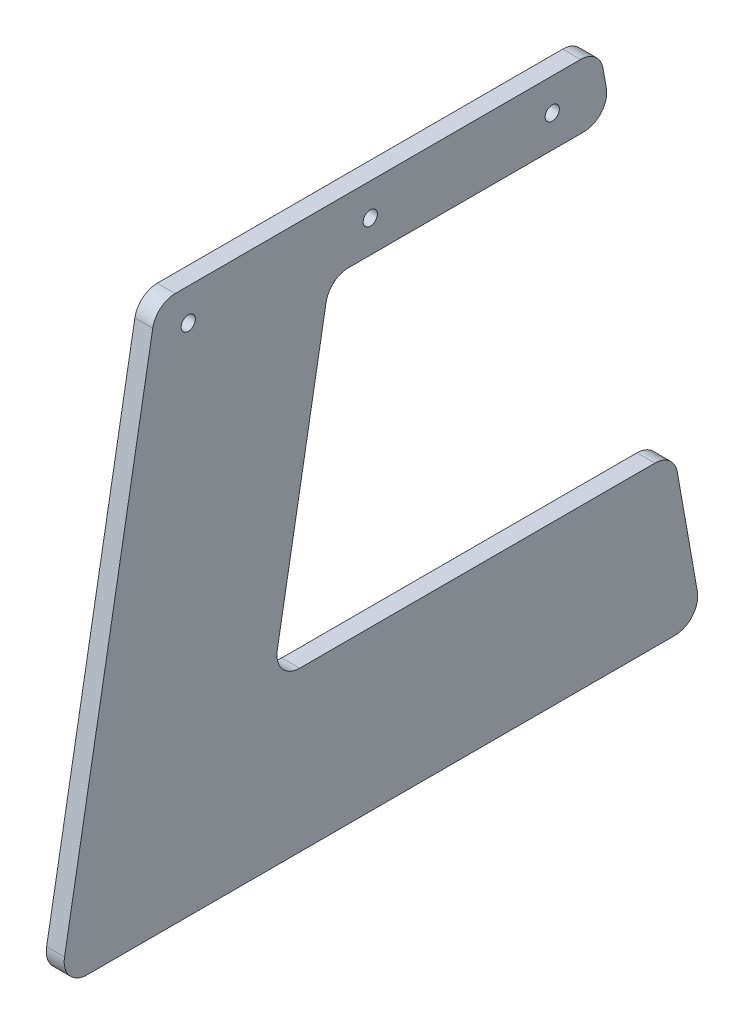
ISO-10303-21;
HEADER;
FILE_DESCRIPTION(('STEP AP214'),'2;1');
FILE_NAME('part.step','',(''),(''),'','','');
FILE_SCHEMA(('AUTOMOTIVE_DESIGN { 1 0 10303 214 1 1 1 1 }'));
ENDSEC;
DATA;
#1=APPLICATION_CONTEXT('core data for automotive mechanical design processes');
#2=APPLICATION_PROTOCOL_DEFINITION('international standard','automotive_design',2000,#1);
#3=PRODUCT_CONTEXT('',#1,'mechanical');
#4=PRODUCT('Part','Part','',(#3));
#5=PRODUCT_RELATED_PRODUCT_CATEGORY('part','',(#4));
#6=PRODUCT_DEFINITION_FORMATION('','',#4);
#7=PRODUCT_DEFINITION_CONTEXT('part definition',#1,'design');
#8=PRODUCT_DEFINITION('design','',#6,#7);
#9=PRODUCT_DEFINITION_SHAPE('','',#8);
#10=(LENGTH_UNIT() NAMED_UNIT(*) SI_UNIT(.MILLI.,.METRE.));
#11=(NAMED_UNIT(*) PLANE_ANGLE_UNIT() SI_UNIT($,.RADIAN.));
#12=(NAMED_UNIT(*) SI_UNIT($,.STERADIAN.) SOLID_ANGLE_UNIT());
#13=UNCERTAINTY_MEASURE_WITH_UNIT(LENGTH_MEASURE(1.E-05),#10,'distance_accuracy_value','');
#14=(GEOMETRIC_REPRESENTATION_CONTEXT(3) GLOBAL_UNCERTAINTY_ASSIGNED_CONTEXT((#13)) GLOBAL_UNIT_ASSIGNED_CONTEXT((#10,
#11,#12)) REPRESENTATION_CONTEXT('',''));
#15=CARTESIAN_POINT('',(0.,0.,0.));
#16=DIRECTION('',(0.,0.,1.));
#17=DIRECTION('',(1.,0.,0.));
#18=AXIS2_PLACEMENT_3D('',#15,#16,#17);
#19=CARTESIAN_POINT('',(10.,139.7,141.743434684048));
#20=DIRECTION('',(1.,0.,0.));
#21=DIRECTION('',(0.,0.,-1.));
#22=AXIS2_PLACEMENT_3D('',#19,#20,#21);
#23=PLANE('',#22);
#24=CARTESIAN_POINT('',(10.,134.439487757862,32.8394877578617));
#25=DIRECTION('',(1.,0.,0.));
#26=DIRECTION('',(0.,0.,-1.));
#27=AXIS2_PLACEMENT_3D('',#24,#25,#26);
#28=CIRCLE('',#27,3.96875);
#29=CARTESIAN_POINT('',(10.,134.439487757862,28.8707377578617));
#30=VERTEX_POINT('',#29);
#31=EDGE_CURVE('E339',#30,#30,#28,.T.);
#32=ORIENTED_EDGE('',*,*,#31,.F.);
#33=EDGE_LOOP('',(#32));
#34=FACE_BOUND('',#33,.T.);
#35=CARTESIAN_POINT('',(10.,139.7,141.743434684048));
#36=DIRECTION('',(1.,0.,0.));
#37=DIRECTION('',(0.,0.,-1.));
#38=AXIS2_PLACEMENT_3D('',#35,#36,#37);
#39=CIRCLE('',#38,12.7);
#40=CARTESIAN_POINT('',(10.,152.4,141.743434684048));
#41=VERTEX_POINT('',#40);
#42=CARTESIAN_POINT('',(10.,141.90533185637,154.250493147304));
#43=VERTEX_POINT('',#42);
#44=EDGE_CURVE('E209',#41,#43,#39,.T.);
#45=ORIENTED_EDGE('',*,*,#44,.T.);
#46=DIRECTION('',(0.,-0.984807753012208,0.173648177666927));
#47=VECTOR('',#46,1.);
#48=CARTESIAN_POINT('',(10.,-137.49466814363,203.516251557248));
#49=LINE('',#48,#47);
#50=CARTESIAN_POINT('',(10.,-137.49466814363,203.516251557248));
#51=VERTEX_POINT('',#50);
#52=EDGE_CURVE('E117',#43,#51,#49,.T.);
#53=ORIENTED_EDGE('',*,*,#52,.T.);
#54=CARTESIAN_POINT('',(10.,-139.7,191.009193093993));
#55=DIRECTION('',(1.,0.,0.));
#56=DIRECTION('',(0.,0.,-1.));
#57=AXIS2_PLACEMENT_3D('',#54,#55,#56);
#58=CIRCLE('',#57,12.7);
#59=CARTESIAN_POINT('',(10.,-152.4,191.009193093993));
#60=VERTEX_POINT('',#59);
#61=EDGE_CURVE('E248',#51,#60,#58,.T.);
#62=ORIENTED_EDGE('',*,*,#61,.T.);
#63=DIRECTION('',(0.,0.,-1.));
#64=VECTOR('',#63,1.);
#65=CARTESIAN_POINT('',(10.,-152.4,191.009193093993));
#66=LINE('',#65,#64);
#67=CARTESIAN_POINT('',(10.,-152.4,-137.264729374053));
#68=VERTEX_POINT('',#67);
#69=EDGE_CURVE('E267',#60,#68,#66,.T.);
#70=ORIENTED_EDGE('',*,*,#69,.T.);
#71=CARTESIAN_POINT('',(10.,-139.7,-137.264729374054));
#72=DIRECTION('',(1.,0.,0.));
#73=DIRECTION('',(0.,0.,-1.));
#74=AXIS2_PLACEMENT_3D('',#71,#72,#73);
#75=CIRCLE('',#74,12.7);
#76=CARTESIAN_POINT('',(10.,-137.49466814363,-149.771787837309));
#77=VERTEX_POINT('',#76);
#78=EDGE_CURVE('E264',#68,#77,#75,.T.);
#79=ORIENTED_EDGE('',*,*,#78,.T.);
#80=DIRECTION('',(0.,0.984807753012207,0.173648177666934));
#81=VECTOR('',#80,1.);
#82=CARTESIAN_POINT('',(10.,-137.49466814363,-149.771787837309));
#83=LINE('',#82,#81);
#84=CARTESIAN_POINT('',(10.,-73.9946681436301,-138.575024562321));
#85=VERTEX_POINT('',#84);
#86=EDGE_CURVE('E266',#77,#85,#83,.T.);
#87=ORIENTED_EDGE('',*,*,#86,.T.);
#88=CARTESIAN_POINT('',(10.,-76.2,-126.067966099066));
#89=DIRECTION('',(1.,0.,0.));
#90=DIRECTION('',(0.,0.,-1.));
#91=AXIS2_PLACEMENT_3D('',#88,#89,#90);
#92=CIRCLE('',#91,12.7);
#93=CARTESIAN_POINT('',(10.,-63.5,-126.067966099066));
#94=VERTEX_POINT('',#93);
#95=EDGE_CURVE('E269',#85,#94,#92,.T.);
#96=ORIENTED_EDGE('',*,*,#95,.T.);
#97=DIRECTION('',(0.,0.,1.));
#98=VECTOR('',#97,1.);
#99=CARTESIAN_POINT('',(10.,-63.5,-126.067966099066));
#100=LINE('',#99,#98);
#101=CARTESIAN_POINT('',(10.,-63.5000000000002,72.2614926490415));
#102=VERTEX_POINT('',#101);
#103=EDGE_CURVE('E275',#94,#102,#100,.T.);
#104=ORIENTED_EDGE('',*,*,#103,.T.);
#105=CARTESIAN_POINT('',(10.,-50.8000000000002,72.2614926490416));
#106=DIRECTION('',(-1.,0.,0.));
#107=DIRECTION('',(0.,0.,1.));
#108=AXIS2_PLACEMENT_3D('',#105,#106,#107);
#109=CIRCLE('',#108,12.7);
#110=CARTESIAN_POINT('',(10.,-48.5946681436299,84.7685511122966));
#111=VERTEX_POINT('',#110);
#112=EDGE_CURVE('E277',#102,#111,#109,.T.);
#113=ORIENTED_EDGE('',*,*,#112,.T.);
#114=DIRECTION('',(0.,0.984807753012206,-0.173648177666941));
#115=VECTOR('',#114,1.);
#116=CARTESIAN_POINT('',(10.,-48.5946681436299,84.7685511122966));
#117=LINE('',#116,#115);
#118=CARTESIAN_POINT('',(10.,105.984307372093,57.5121070785997));
#119=VERTEX_POINT('',#118);
#120=EDGE_CURVE('E279',#111,#119,#117,.T.);
#121=ORIENTED_EDGE('',*,*,#120,.T.);
#122=CARTESIAN_POINT('',(10.,103.778975515723,45.0050486153447));
#123=DIRECTION('',(-1.,0.,0.));
#124=DIRECTION('',(0.,0.,-1.));
#125=AXIS2_PLACEMENT_3D('',#122,#123,#124);
#126=CIRCLE('',#125,12.7);
#127=CARTESIAN_POINT('',(10.,116.478975515723,45.0050486153446));
#128=VERTEX_POINT('',#127);
#129=EDGE_CURVE('E281',#119,#128,#126,.T.);
#130=ORIENTED_EDGE('',*,*,#129,.T.);
#131=DIRECTION('',(0.,0.,-1.));
#132=VECTOR('',#131,1.);
#133=CARTESIAN_POINT('',(10.,116.478975515723,-86.4485751653208));
#134=LINE('',#133,#132);
#135=CARTESIAN_POINT('',(10.,116.478975515723,-86.4485751653208));
#136=VERTEX_POINT('',#135);
#137=EDGE_CURVE('E283',#128,#136,#134,.T.);
#138=ORIENTED_EDGE('',*,*,#137,.T.);
#139=CARTESIAN_POINT('',(10.,129.178975515723,-86.4485751653209));
#140=DIRECTION('',(1.,0.,0.));
#141=DIRECTION('',(0.,0.,-1.));
#142=AXIS2_PLACEMENT_3D('',#139,#140,#141);
#143=CIRCLE('',#142,12.7);
#144=CARTESIAN_POINT('',(10.,131.384307372093,-98.9556336285759));
#145=VERTEX_POINT('',#144);
#146=EDGE_CURVE('E160',#136,#145,#143,.T.);
#147=ORIENTED_EDGE('',*,*,#146,.T.);
#148=DIRECTION('',(0.,0.984807753012208,0.173648177666933));
#149=VECTOR('',#148,1.);
#150=CARTESIAN_POINT('',(10.,131.384307372093,-98.9556336285759));
#151=LINE('',#150,#149);
#152=CARTESIAN_POINT('',(10.,141.90533185637,-97.1004931473036));
#153=VERTEX_POINT('',#152);
#154=EDGE_CURVE('E154',#145,#153,#151,.T.);
#155=ORIENTED_EDGE('',*,*,#154,.T.);
#156=CARTESIAN_POINT('',(10.,139.7,-84.5934346840485));
#157=DIRECTION('',(1.,0.,0.));
#158=DIRECTION('',(0.,0.,1.));
#159=AXIS2_PLACEMENT_3D('',#156,#157,#158);
#160=CIRCLE('',#159,12.7);
#161=CARTESIAN_POINT('',(10.,152.4,-84.5934346840484));
#162=VERTEX_POINT('',#161);
#163=EDGE_CURVE('E158',#153,#162,#160,.T.);
#164=ORIENTED_EDGE('',*,*,#163,.T.);
#165=DIRECTION('',(0.,0.,1.));
#166=VECTOR('',#165,1.);
#167=CARTESIAN_POINT('',(10.,152.4,141.743434684048));
#168=LINE('',#167,#166);
#169=EDGE_CURVE('E50',#162,#41,#168,.T.);
#170=ORIENTED_EDGE('',*,*,#169,.T.);
#171=EDGE_LOOP('',(#45,#53,#62,#70,#79,#87,#96,#104,#113,#121,#130,#138,#147,#155,#164,#170));
#172=FACE_BOUND('',#171,.T.);
#173=CARTESIAN_POINT('',(10.,134.439487757862,134.439487757862));
#174=DIRECTION('',(1.,0.,0.));
#175=DIRECTION('',(0.,0.,-1.));
#176=AXIS2_PLACEMENT_3D('',#173,#174,#175);
#177=CIRCLE('',#176,3.96874999999999);
#178=CARTESIAN_POINT('',(10.,134.439487757862,130.470737757862));
#179=VERTEX_POINT('',#178);
#180=EDGE_CURVE('E182',#179,#179,#177,.T.);
#181=ORIENTED_EDGE('',*,*,#180,.F.);
#182=EDGE_LOOP('',(#181));
#183=FACE_BOUND('',#182,.T.);
#184=CARTESIAN_POINT('',(10.,134.439487757862,-68.7605122421383));
#185=DIRECTION('',(1.,0.,0.));
#186=DIRECTION('',(0.,0.,-1.));
#187=AXIS2_PLACEMENT_3D('',#184,#185,#186);
#188=CIRCLE('',#187,3.96874999999999);
#189=CARTESIAN_POINT('',(10.,134.439487757862,-72.7292622421383));
#190=VERTEX_POINT('',#189);
#191=EDGE_CURVE('E330',#190,#190,#188,.T.);
#192=ORIENTED_EDGE('',*,*,#191,.F.);
#193=EDGE_LOOP('',(#192));
#194=FACE_BOUND('',#193,.T.);
#195=ADVANCED_FACE('F33',(#34,#172,#183,#194),#23,.T.);
#196=CARTESIAN_POINT('',(0.,139.7,141.743434684048));
#197=DIRECTION('',(1.,0.,0.));
#198=DIRECTION('',(0.,0.,-1.));
#199=AXIS2_PLACEMENT_3D('',#196,#197,#198);
#200=PLANE('',#199);
#201=CARTESIAN_POINT('',(0.,134.439487757862,32.8394877578617));
#202=DIRECTION('',(1.,0.,0.));
#203=DIRECTION('',(0.,0.,-1.));
#204=AXIS2_PLACEMENT_3D('',#201,#202,#203);
#205=CIRCLE('',#204,3.96875);
#206=CARTESIAN_POINT('',(0.,134.439487757862,28.8707377578617));
#207=VERTEX_POINT('',#206);
#208=EDGE_CURVE('E336',#207,#207,#205,.T.);
#209=ORIENTED_EDGE('',*,*,#208,.T.);
#210=EDGE_LOOP('',(#209));
#211=FACE_BOUND('',#210,.T.);
#212=CARTESIAN_POINT('',(0.,139.7,141.743434684048));
#213=DIRECTION('',(1.,0.,0.));
#214=DIRECTION('',(0.,0.,-1.));
#215=AXIS2_PLACEMENT_3D('',#212,#213,#214);
#216=CIRCLE('',#215,12.7);
#217=CARTESIAN_POINT('',(0.,152.4,141.743434684048));
#218=VERTEX_POINT('',#217);
#219=CARTESIAN_POINT('',(0.,141.90533185637,154.250493147304));
#220=VERTEX_POINT('',#219);
#221=EDGE_CURVE('E178',#218,#220,#216,.T.);
#222=ORIENTED_EDGE('',*,*,#221,.F.);
#223=DIRECTION('',(0.,0.,1.));
#224=VECTOR('',#223,1.);
#225=CARTESIAN_POINT('',(0.,152.4,141.743434684048));
#226=LINE('',#225,#224);
#227=CARTESIAN_POINT('',(0.,152.4,-84.5934346840484));
#228=VERTEX_POINT('',#227);
#229=EDGE_CURVE('E109',#228,#218,#226,.T.);
#230=ORIENTED_EDGE('',*,*,#229,.F.);
#231=CARTESIAN_POINT('',(0.,139.7,-84.5934346840485));
#232=DIRECTION('',(1.,0.,0.));
#233=DIRECTION('',(0.,0.,1.));
#234=AXIS2_PLACEMENT_3D('',#231,#232,#233);
#235=CIRCLE('',#234,12.7);
#236=CARTESIAN_POINT('',(0.,141.90533185637,-97.1004931473036));
#237=VERTEX_POINT('',#236);
#238=EDGE_CURVE('E103',#237,#228,#235,.T.);
#239=ORIENTED_EDGE('',*,*,#238,.F.);
#240=DIRECTION('',(0.,0.984807753012208,0.173648177666933));
#241=VECTOR('',#240,1.);
#242=CARTESIAN_POINT('',(0.,131.384307372093,-98.9556336285759));
#243=LINE('',#242,#241);
#244=CARTESIAN_POINT('',(0.,131.384307372093,-98.9556336285759));
#245=VERTEX_POINT('',#244);
#246=EDGE_CURVE('E168',#245,#237,#243,.T.);
#247=ORIENTED_EDGE('',*,*,#246,.F.);
#248=CARTESIAN_POINT('',(0.,129.178975515723,-86.4485751653209));
#249=DIRECTION('',(1.,0.,0.));
#250=DIRECTION('',(0.,0.,-1.));
#251=AXIS2_PLACEMENT_3D('',#248,#249,#250);
#252=CIRCLE('',#251,12.7);
#253=CARTESIAN_POINT('',(0.,116.478975515723,-86.4485751653208));
#254=VERTEX_POINT('',#253);
#255=EDGE_CURVE('E204',#254,#245,#252,.T.);
#256=ORIENTED_EDGE('',*,*,#255,.F.);
#257=DIRECTION('',(0.,0.,-1.));
#258=VECTOR('',#257,1.);
#259=CARTESIAN_POINT('',(0.,116.478975515723,-86.4485751653208));
#260=LINE('',#259,#258);
#261=CARTESIAN_POINT('',(0.,116.478975515723,45.0050486153446));
#262=VERTEX_POINT('',#261);
#263=EDGE_CURVE('E202',#262,#254,#260,.T.);
#264=ORIENTED_EDGE('',*,*,#263,.F.);
#265=CARTESIAN_POINT('',(0.,103.778975515723,45.0050486153447));
#266=DIRECTION('',(-1.,0.,0.));
#267=DIRECTION('',(0.,0.,-1.));
#268=AXIS2_PLACEMENT_3D('',#265,#266,#267);
#269=CIRCLE('',#268,12.7);
#270=CARTESIAN_POINT('',(0.,105.984307372093,57.5121070785997));
#271=VERTEX_POINT('',#270);
#272=EDGE_CURVE('E200',#271,#262,#269,.T.);
#273=ORIENTED_EDGE('',*,*,#272,.F.);
#274=DIRECTION('',(0.,0.984807753012206,-0.173648177666941));
#275=VECTOR('',#274,1.);
#276=CARTESIAN_POINT('',(0.,-48.5946681436299,84.7685511122966));
#277=LINE('',#276,#275);
#278=CARTESIAN_POINT('',(0.,-48.5946681436299,84.7685511122966));
#279=VERTEX_POINT('',#278);
#280=EDGE_CURVE('E198',#279,#271,#277,.T.);
#281=ORIENTED_EDGE('',*,*,#280,.F.);
#282=CARTESIAN_POINT('',(0.,-50.8000000000002,72.2614926490416));
#283=DIRECTION('',(-1.,0.,0.));
#284=DIRECTION('',(0.,0.,1.));
#285=AXIS2_PLACEMENT_3D('',#282,#283,#284);
#286=CIRCLE('',#285,12.7);
#287=CARTESIAN_POINT('',(0.,-63.5000000000002,72.2614926490415));
#288=VERTEX_POINT('',#287);
#289=EDGE_CURVE('E196',#288,#279,#286,.T.);
#290=ORIENTED_EDGE('',*,*,#289,.F.);
#291=DIRECTION('',(0.,0.,1.));
#292=VECTOR('',#291,1.);
#293=CARTESIAN_POINT('',(0.,-63.5,-126.067966099066));
#294=LINE('',#293,#292);
#295=CARTESIAN_POINT('',(0.,-63.5,-126.067966099066));
#296=VERTEX_POINT('',#295);
#297=EDGE_CURVE('E194',#296,#288,#294,.T.);
#298=ORIENTED_EDGE('',*,*,#297,.F.);
#299=CARTESIAN_POINT('',(0.,-76.2,-126.067966099066));
#300=DIRECTION('',(1.,0.,0.));
#301=DIRECTION('',(0.,0.,-1.));
#302=AXIS2_PLACEMENT_3D('',#299,#300,#301);
#303=CIRCLE('',#302,12.7);
#304=CARTESIAN_POINT('',(0.,-73.9946681436301,-138.575024562321));
#305=VERTEX_POINT('',#304);
#306=EDGE_CURVE('E192',#305,#296,#303,.T.);
#307=ORIENTED_EDGE('',*,*,#306,.F.);
#308=DIRECTION('',(0.,0.984807753012207,0.173648177666934));
#309=VECTOR('',#308,1.);
#310=CARTESIAN_POINT('',(0.,-137.49466814363,-149.771787837309));
#311=LINE('',#310,#309);
#312=CARTESIAN_POINT('',(0.,-137.49466814363,-149.771787837309));
#313=VERTEX_POINT('',#312);
#314=EDGE_CURVE('E190',#313,#305,#311,.T.);
#315=ORIENTED_EDGE('',*,*,#314,.F.);
#316=CARTESIAN_POINT('',(0.,-139.7,-137.264729374054));
#317=DIRECTION('',(1.,0.,0.));
#318=DIRECTION('',(0.,0.,-1.));
#319=AXIS2_PLACEMENT_3D('',#316,#317,#318);
#320=CIRCLE('',#319,12.7);
#321=CARTESIAN_POINT('',(0.,-152.4,-137.264729374053));
#322=VERTEX_POINT('',#321);
#323=EDGE_CURVE('E188',#322,#313,#320,.T.);
#324=ORIENTED_EDGE('',*,*,#323,.F.);
#325=DIRECTION('',(0.,0.,-1.));
#326=VECTOR('',#325,1.);
#327=CARTESIAN_POINT('',(0.,-152.4,191.009193093993));
#328=LINE('',#327,#326);
#329=CARTESIAN_POINT('',(0.,-152.4,191.009193093993));
#330=VERTEX_POINT('',#329);
#331=EDGE_CURVE('E186',#330,#322,#328,.T.);
#332=ORIENTED_EDGE('',*,*,#331,.F.);
#333=CARTESIAN_POINT('',(0.,-139.7,191.009193093993));
#334=DIRECTION('',(1.,0.,0.));
#335=DIRECTION('',(0.,0.,-1.));
#336=AXIS2_PLACEMENT_3D('',#333,#334,#335);
#337=CIRCLE('',#336,12.7);
#338=CARTESIAN_POINT('',(0.,-137.49466814363,203.516251557248));
#339=VERTEX_POINT('',#338);
#340=EDGE_CURVE('E184',#339,#330,#337,.T.);
#341=ORIENTED_EDGE('',*,*,#340,.F.);
#342=DIRECTION('',(0.,-0.984807753012208,0.173648177666927));
#343=VECTOR('',#342,1.);
#344=CARTESIAN_POINT('',(0.,-137.49466814363,203.516251557248));
#345=LINE('',#344,#343);
#346=EDGE_CURVE('E181',#220,#339,#345,.T.);
#347=ORIENTED_EDGE('',*,*,#346,.F.);
#348=EDGE_LOOP('',(#222,#230,#239,#247,#256,#264,#273,#281,#290,#298,#307,#315,#324,#332,#341,#347));
#349=FACE_BOUND('',#348,.T.);
#350=CARTESIAN_POINT('',(0.,134.439487757862,134.439487757862));
#351=DIRECTION('',(1.,0.,0.));
#352=DIRECTION('',(0.,0.,-1.));
#353=AXIS2_PLACEMENT_3D('',#350,#351,#352);
#354=CIRCLE('',#353,3.96874999999999);
#355=CARTESIAN_POINT('',(0.,134.439487757862,130.470737757862));
#356=VERTEX_POINT('',#355);
#357=EDGE_CURVE('E342',#356,#356,#354,.T.);
#358=ORIENTED_EDGE('',*,*,#357,.T.);
#359=EDGE_LOOP('',(#358));
#360=FACE_BOUND('',#359,.T.);
#361=CARTESIAN_POINT('',(0.,134.439487757862,-68.7605122421383));
#362=DIRECTION('',(1.,0.,0.));
#363=DIRECTION('',(0.,0.,-1.));
#364=AXIS2_PLACEMENT_3D('',#361,#362,#363);
#365=CIRCLE('',#364,3.96874999999999);
#366=CARTESIAN_POINT('',(0.,134.439487757862,-72.7292622421383));
#367=VERTEX_POINT('',#366);
#368=EDGE_CURVE('E333',#367,#367,#365,.T.);
#369=ORIENTED_EDGE('',*,*,#368,.T.);
#370=EDGE_LOOP('',(#369));
#371=FACE_BOUND('',#370,.T.);
#372=ADVANCED_FACE('F252',(#211,#349,#360,#371),#200,.F.);
#373=CARTESIAN_POINT('',(10.,139.7,141.743434684048));
#374=DIRECTION('',(-1.,0.,0.));
#375=DIRECTION('',(0.,0.,1.));
#376=AXIS2_PLACEMENT_3D('',#373,#374,#375);
#377=CYLINDRICAL_SURFACE('',#376,12.7);
#378=ORIENTED_EDGE('',*,*,#221,.T.);
#379=DIRECTION('',(-1.,0.,0.));
#380=VECTOR('',#379,1.);
#381=CARTESIAN_POINT('',(10.,141.90533185637,154.250493147304));
#382=LINE('',#381,#380);
#383=EDGE_CURVE('E11',#43,#220,#382,.T.);
#384=ORIENTED_EDGE('',*,*,#383,.F.);
#385=ORIENTED_EDGE('',*,*,#44,.F.);
#386=DIRECTION('',(-1.,0.,0.));
#387=VECTOR('',#386,1.);
#388=CARTESIAN_POINT('',(10.,152.4,141.743434684048));
#389=LINE('',#388,#387);
#390=EDGE_CURVE('E174',#41,#218,#389,.T.);
#391=ORIENTED_EDGE('',*,*,#390,.T.);
#392=EDGE_LOOP('',(#378,#384,#385,#391));
#393=FACE_BOUND('',#392,.T.);
#394=ADVANCED_FACE('F35',(#393),#377,.T.);
#395=CARTESIAN_POINT('',(10.,-137.49466814363,203.516251557248));
#396=DIRECTION('',(0.,-0.173648177666927,-0.984807753012209));
#397=DIRECTION('',(0.,0.984807753012209,-0.173648177666927));
#398=AXIS2_PLACEMENT_3D('',#395,#396,#397);
#399=PLANE('',#398);
#400=ORIENTED_EDGE('',*,*,#346,.T.);
#401=DIRECTION('',(-1.,0.,0.));
#402=VECTOR('',#401,1.);
#403=CARTESIAN_POINT('',(10.,-137.49466814363,203.516251557248));
#404=LINE('',#403,#402);
#405=EDGE_CURVE('E42',#51,#339,#404,.T.);
#406=ORIENTED_EDGE('',*,*,#405,.F.);
#407=ORIENTED_EDGE('',*,*,#52,.F.);
#408=ORIENTED_EDGE('',*,*,#383,.T.);
#409=EDGE_LOOP('',(#400,#406,#407,#408));
#410=FACE_BOUND('',#409,.T.);
#411=ADVANCED_FACE('F483',(#410),#399,.F.);
#412=CARTESIAN_POINT('',(10.,-139.7,191.009193093993));
#413=DIRECTION('',(-1.,0.,0.));
#414=DIRECTION('',(0.,0.,1.));
#415=AXIS2_PLACEMENT_3D('',#412,#413,#414);
#416=CYLINDRICAL_SURFACE('',#415,12.7);
#417=ORIENTED_EDGE('',*,*,#340,.T.);
#418=DIRECTION('',(-1.,0.,0.));
#419=VECTOR('',#418,1.);
#420=CARTESIAN_POINT('',(10.,-152.4,191.009193093993));
#421=LINE('',#420,#419);
#422=EDGE_CURVE('E240',#60,#330,#421,.T.);
#423=ORIENTED_EDGE('',*,*,#422,.F.);
#424=ORIENTED_EDGE('',*,*,#61,.F.);
#425=ORIENTED_EDGE('',*,*,#405,.T.);
#426=EDGE_LOOP('',(#417,#423,#424,#425));
#427=FACE_BOUND('',#426,.T.);
#428=ADVANCED_FACE('F246',(#427),#416,.T.);
#429=CARTESIAN_POINT('',(10.,-152.4,191.009193093993));
#430=DIRECTION('',(0.,1.,0.));
#431=DIRECTION('',(0.,0.,1.));
#432=AXIS2_PLACEMENT_3D('',#429,#430,#431);
#433=PLANE('',#432);
#434=ORIENTED_EDGE('',*,*,#331,.T.);
#435=DIRECTION('',(-1.,0.,0.));
#436=VECTOR('',#435,1.);
#437=CARTESIAN_POINT('',(10.,-152.4,-137.264729374053));
#438=LINE('',#437,#436);
#439=EDGE_CURVE('E237',#68,#322,#438,.T.);
#440=ORIENTED_EDGE('',*,*,#439,.F.);
#441=ORIENTED_EDGE('',*,*,#69,.F.);
#442=ORIENTED_EDGE('',*,*,#422,.T.);
#443=EDGE_LOOP('',(#434,#440,#441,#442));
#444=FACE_BOUND('',#443,.T.);
#445=ADVANCED_FACE('F258',(#444),#433,.F.);
#446=CARTESIAN_POINT('',(10.,-139.7,-137.264729374054));
#447=DIRECTION('',(-1.,0.,0.));
#448=DIRECTION('',(0.,0.,1.));
#449=AXIS2_PLACEMENT_3D('',#446,#447,#448);
#450=CYLINDRICAL_SURFACE('',#449,12.7);
#451=ORIENTED_EDGE('',*,*,#323,.T.);
#452=DIRECTION('',(-1.,0.,0.));
#453=VECTOR('',#452,1.);
#454=CARTESIAN_POINT('',(10.,-137.49466814363,-149.771787837309));
#455=LINE('',#454,#453);
#456=EDGE_CURVE('E234',#77,#313,#455,.T.);
#457=ORIENTED_EDGE('',*,*,#456,.F.);
#458=ORIENTED_EDGE('',*,*,#78,.F.);
#459=ORIENTED_EDGE('',*,*,#439,.T.);
#460=EDGE_LOOP('',(#451,#457,#458,#459));
#461=FACE_BOUND('',#460,.T.);
#462=ADVANCED_FACE('F262',(#461),#450,.T.);
#463=CARTESIAN_POINT('',(10.,-137.49466814363,-149.771787837309));
#464=DIRECTION('',(0.,-0.173648177666934,0.984807753012207));
#465=DIRECTION('',(0.,-0.984807753012207,-0.173648177666934));
#466=AXIS2_PLACEMENT_3D('',#463,#464,#465);
#467=PLANE('',#466);
#468=ORIENTED_EDGE('',*,*,#314,.T.);
#469=DIRECTION('',(-1.,0.,0.));
#470=VECTOR('',#469,1.);
#471=CARTESIAN_POINT('',(10.,-73.9946681436301,-138.575024562321));
#472=LINE('',#471,#470);
#473=EDGE_CURVE('E231',#85,#305,#472,.T.);
#474=ORIENTED_EDGE('',*,*,#473,.F.);
#475=ORIENTED_EDGE('',*,*,#86,.F.);
#476=ORIENTED_EDGE('',*,*,#456,.T.);
#477=EDGE_LOOP('',(#468,#474,#475,#476));
#478=FACE_BOUND('',#477,.T.);
#479=ADVANCED_FACE('F448',(#478),#467,.F.);
#480=CARTESIAN_POINT('',(10.,-76.2,-126.067966099066));
#481=DIRECTION('',(-1.,0.,0.));
#482=DIRECTION('',(0.,0.,1.));
#483=AXIS2_PLACEMENT_3D('',#480,#481,#482);
#484=CYLINDRICAL_SURFACE('',#483,12.7);
#485=ORIENTED_EDGE('',*,*,#306,.T.);
#486=DIRECTION('',(-1.,0.,0.));
#487=VECTOR('',#486,1.);
#488=CARTESIAN_POINT('',(10.,-63.5,-126.067966099066));
#489=LINE('',#488,#487);
#490=EDGE_CURVE('E228',#94,#296,#489,.T.);
#491=ORIENTED_EDGE('',*,*,#490,.F.);
#492=ORIENTED_EDGE('',*,*,#95,.F.);
#493=ORIENTED_EDGE('',*,*,#473,.T.);
#494=EDGE_LOOP('',(#485,#491,#492,#493));
#495=FACE_BOUND('',#494,.T.);
#496=ADVANCED_FACE('F438',(#495),#484,.T.);
#497=CARTESIAN_POINT('',(10.,-63.5,-126.067966099066));
#498=DIRECTION('',(0.,-1.,0.));
#499=DIRECTION('',(0.,0.,-1.));
#500=AXIS2_PLACEMENT_3D('',#497,#498,#499);
#501=PLANE('',#500);
#502=ORIENTED_EDGE('',*,*,#297,.T.);
#503=DIRECTION('',(-1.,0.,0.));
#504=VECTOR('',#503,1.);
#505=CARTESIAN_POINT('',(10.,-63.5000000000002,72.2614926490415));
#506=LINE('',#505,#504);
#507=EDGE_CURVE('E225',#102,#288,#506,.T.);
#508=ORIENTED_EDGE('',*,*,#507,.F.);
#509=ORIENTED_EDGE('',*,*,#103,.F.);
#510=ORIENTED_EDGE('',*,*,#490,.T.);
#511=EDGE_LOOP('',(#502,#508,#509,#510));
#512=FACE_BOUND('',#511,.T.);
#513=ADVANCED_FACE('F428',(#512),#501,.F.);
#514=CARTESIAN_POINT('',(10.,-50.8000000000002,72.2614926490416));
#515=DIRECTION('',(-1.,0.,0.));
#516=DIRECTION('',(0.,0.,1.));
#517=AXIS2_PLACEMENT_3D('',#514,#515,#516);
#518=CYLINDRICAL_SURFACE('',#517,12.7);
#519=ORIENTED_EDGE('',*,*,#289,.T.);
#520=DIRECTION('',(-1.,0.,0.));
#521=VECTOR('',#520,1.);
#522=CARTESIAN_POINT('',(10.,-48.5946681436299,84.7685511122966));
#523=LINE('',#522,#521);
#524=EDGE_CURVE('E222',#111,#279,#523,.T.);
#525=ORIENTED_EDGE('',*,*,#524,.F.);
#526=ORIENTED_EDGE('',*,*,#112,.F.);
#527=ORIENTED_EDGE('',*,*,#507,.T.);
#528=EDGE_LOOP('',(#519,#525,#526,#527));
#529=FACE_BOUND('',#528,.T.);
#530=ADVANCED_FACE('F418',(#529),#518,.F.);
#531=CARTESIAN_POINT('',(10.,-48.5946681436299,84.7685511122966));
#532=DIRECTION('',(0.,0.173648177666941,0.984807753012206));
#533=DIRECTION('',(0.,-0.984807753012206,0.173648177666941));
#534=AXIS2_PLACEMENT_3D('',#531,#532,#533);
#535=PLANE('',#534);
#536=ORIENTED_EDGE('',*,*,#280,.T.);
#537=DIRECTION('',(-1.,0.,0.));
#538=VECTOR('',#537,1.);
#539=CARTESIAN_POINT('',(10.,105.984307372093,57.5121070785997));
#540=LINE('',#539,#538);
#541=EDGE_CURVE('E219',#119,#271,#540,.T.);
#542=ORIENTED_EDGE('',*,*,#541,.F.);
#543=ORIENTED_EDGE('',*,*,#120,.F.);
#544=ORIENTED_EDGE('',*,*,#524,.T.);
#545=EDGE_LOOP('',(#536,#542,#543,#544));
#546=FACE_BOUND('',#545,.T.);
#547=ADVANCED_FACE('F408',(#546),#535,.F.);
#548=CARTESIAN_POINT('',(10.,103.778975515723,45.0050486153447));
#549=DIRECTION('',(-1.,0.,0.));
#550=DIRECTION('',(0.,0.,1.));
#551=AXIS2_PLACEMENT_3D('',#548,#549,#550);
#552=CYLINDRICAL_SURFACE('',#551,12.7);
#553=ORIENTED_EDGE('',*,*,#272,.T.);
#554=DIRECTION('',(-1.,0.,0.));
#555=VECTOR('',#554,1.);
#556=CARTESIAN_POINT('',(10.,116.478975515723,45.0050486153446));
#557=LINE('',#556,#555);
#558=EDGE_CURVE('E216',#128,#262,#557,.T.);
#559=ORIENTED_EDGE('',*,*,#558,.F.);
#560=ORIENTED_EDGE('',*,*,#129,.F.);
#561=ORIENTED_EDGE('',*,*,#541,.T.);
#562=EDGE_LOOP('',(#553,#559,#560,#561));
#563=FACE_BOUND('',#562,.T.);
#564=ADVANCED_FACE('F399',(#563),#552,.F.);
#565=CARTESIAN_POINT('',(10.,116.478975515723,-86.4485751653208));
#566=DIRECTION('',(0.,1.,0.));
#567=DIRECTION('',(0.,0.,1.));
#568=AXIS2_PLACEMENT_3D('',#565,#566,#567);
#569=PLANE('',#568);
#570=ORIENTED_EDGE('',*,*,#263,.T.);
#571=DIRECTION('',(-1.,0.,0.));
#572=VECTOR('',#571,1.);
#573=CARTESIAN_POINT('',(10.,116.478975515723,-86.4485751653208));
#574=LINE('',#573,#572);
#575=EDGE_CURVE('E213',#136,#254,#574,.T.);
#576=ORIENTED_EDGE('',*,*,#575,.F.);
#577=ORIENTED_EDGE('',*,*,#137,.F.);
#578=ORIENTED_EDGE('',*,*,#558,.T.);
#579=EDGE_LOOP('',(#570,#576,#577,#578));
#580=FACE_BOUND('',#579,.T.);
#581=ADVANCED_FACE('F289',(#580),#569,.F.);
#582=CARTESIAN_POINT('',(10.,129.178975515723,-86.4485751653209));
#583=DIRECTION('',(-1.,0.,0.));
#584=DIRECTION('',(0.,0.,1.));
#585=AXIS2_PLACEMENT_3D('',#582,#583,#584);
#586=CYLINDRICAL_SURFACE('',#585,12.7);
#587=ORIENTED_EDGE('',*,*,#255,.T.);
#588=DIRECTION('',(-1.,0.,0.));
#589=VECTOR('',#588,1.);
#590=CARTESIAN_POINT('',(10.,131.384307372093,-98.9556336285759));
#591=LINE('',#590,#589);
#592=EDGE_CURVE('E169',#145,#245,#591,.T.);
#593=ORIENTED_EDGE('',*,*,#592,.F.);
#594=ORIENTED_EDGE('',*,*,#146,.F.);
#595=ORIENTED_EDGE('',*,*,#575,.T.);
#596=EDGE_LOOP('',(#587,#593,#594,#595));
#597=FACE_BOUND('',#596,.T.);
#598=ADVANCED_FACE('F293',(#597),#586,.T.);
#599=CARTESIAN_POINT('',(10.,131.384307372093,-98.9556336285759));
#600=DIRECTION('',(0.,-0.173648177666933,0.984807753012208));
#601=DIRECTION('',(0.,-0.984807753012208,-0.173648177666933));
#602=AXIS2_PLACEMENT_3D('',#599,#600,#601);
#603=PLANE('',#602);
#604=ORIENTED_EDGE('',*,*,#246,.T.);
#605=DIRECTION('',(-1.,0.,0.));
#606=VECTOR('',#605,1.);
#607=CARTESIAN_POINT('',(10.,141.90533185637,-97.1004931473036));
#608=LINE('',#607,#606);
#609=EDGE_CURVE('E165',#153,#237,#608,.T.);
#610=ORIENTED_EDGE('',*,*,#609,.F.);
#611=ORIENTED_EDGE('',*,*,#154,.F.);
#612=ORIENTED_EDGE('',*,*,#592,.T.);
#613=EDGE_LOOP('',(#604,#610,#611,#612));
#614=FACE_BOUND('',#613,.T.);
#615=ADVANCED_FACE('F166',(#614),#603,.F.);
#616=CARTESIAN_POINT('',(10.,139.7,-84.5934346840485));
#617=DIRECTION('',(-1.,0.,0.));
#618=DIRECTION('',(0.,0.,1.));
#619=AXIS2_PLACEMENT_3D('',#616,#617,#618);
#620=CYLINDRICAL_SURFACE('',#619,12.7);
#621=ORIENTED_EDGE('',*,*,#238,.T.);
#622=DIRECTION('',(-1.,0.,0.));
#623=VECTOR('',#622,1.);
#624=CARTESIAN_POINT('',(10.,152.4,-84.5934346840484));
#625=LINE('',#624,#623);
#626=EDGE_CURVE('E170',#162,#228,#625,.T.);
#627=ORIENTED_EDGE('',*,*,#626,.F.);
#628=ORIENTED_EDGE('',*,*,#163,.F.);
#629=ORIENTED_EDGE('',*,*,#609,.T.);
#630=EDGE_LOOP('',(#621,#627,#628,#629));
#631=FACE_BOUND('',#630,.T.);
#632=ADVANCED_FACE('F172',(#631),#620,.T.);
#633=CARTESIAN_POINT('',(10.,152.4,141.743434684048));
#634=DIRECTION('',(0.,-1.,0.));
#635=DIRECTION('',(0.,0.,-1.));
#636=AXIS2_PLACEMENT_3D('',#633,#634,#635);
#637=PLANE('',#636);
#638=ORIENTED_EDGE('',*,*,#229,.T.);
#639=ORIENTED_EDGE('',*,*,#390,.F.);
#640=ORIENTED_EDGE('',*,*,#169,.F.);
#641=ORIENTED_EDGE('',*,*,#626,.T.);
#642=EDGE_LOOP('',(#638,#639,#640,#641));
#643=FACE_BOUND('',#642,.T.);
#644=ADVANCED_FACE('F297',(#643),#637,.F.);
#645=CARTESIAN_POINT('',(10.,134.439487757862,134.439487757862));
#646=DIRECTION('',(-1.,0.,0.));
#647=DIRECTION('',(0.,0.,1.));
#648=AXIS2_PLACEMENT_3D('',#645,#646,#647);
#649=CYLINDRICAL_SURFACE('',#648,3.96874999999999);
#650=ORIENTED_EDGE('',*,*,#180,.T.);
#651=EDGE_LOOP('',(#650));
#652=FACE_BOUND('',#651,.T.);
#653=ORIENTED_EDGE('',*,*,#357,.F.);
#654=EDGE_LOOP('',(#653));
#655=FACE_BOUND('',#654,.T.);
#656=ADVANCED_FACE('F299',(#652,#655),#649,.F.);
#657=CARTESIAN_POINT('',(10.,134.439487757862,32.8394877578617));
#658=DIRECTION('',(-1.,0.,0.));
#659=DIRECTION('',(0.,0.,1.));
#660=AXIS2_PLACEMENT_3D('',#657,#658,#659);
#661=CYLINDRICAL_SURFACE('',#660,3.96875);
#662=ORIENTED_EDGE('',*,*,#31,.T.);
#663=EDGE_LOOP('',(#662));
#664=FACE_BOUND('',#663,.T.);
#665=ORIENTED_EDGE('',*,*,#208,.F.);
#666=EDGE_LOOP('',(#665));
#667=FACE_BOUND('',#666,.T.);
#668=ADVANCED_FACE('F305',(#664,#667),#661,.F.);
#669=CARTESIAN_POINT('',(10.,134.439487757862,-68.7605122421383));
#670=DIRECTION('',(-1.,0.,0.));
#671=DIRECTION('',(0.,0.,1.));
#672=AXIS2_PLACEMENT_3D('',#669,#670,#671);
#673=CYLINDRICAL_SURFACE('',#672,3.96874999999999);
#674=ORIENTED_EDGE('',*,*,#191,.T.);
#675=EDGE_LOOP('',(#674));
#676=FACE_BOUND('',#675,.T.);
#677=ORIENTED_EDGE('',*,*,#368,.F.);
#678=EDGE_LOOP('',(#677));
#679=FACE_BOUND('',#678,.T.);
#680=ADVANCED_FACE('F321',(#676,#679),#673,.F.);
#681=CLOSED_SHELL('',(#195,#372,#394,#411,#428,#445,#462,#479,#496,#513,#530,#547,#564,#581,
#598,#615,#632,#644,#656,#668,#680));
#682=MANIFOLD_SOLID_BREP('B2',#681);
#683=ADVANCED_BREP_SHAPE_REPRESENTATION('',(#18,#682),#14);
#684=SHAPE_DEFINITION_REPRESENTATION(#9,#683);
ENDSEC;
END-ISO-10303-21;
